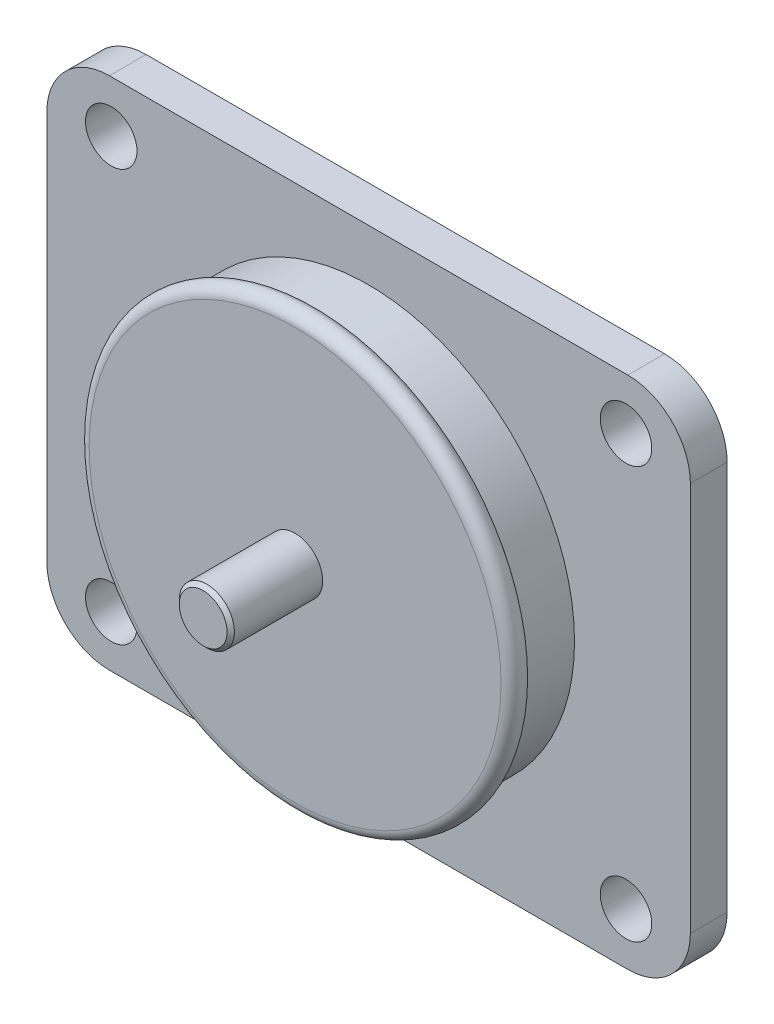
ISO-10303-21;
HEADER;
FILE_DESCRIPTION(('STEP AP214'),'2;1');
FILE_NAME('part.step','',(''),(''),'','','');
FILE_SCHEMA(('AUTOMOTIVE_DESIGN { 1 0 10303 214 1 1 1 1 }'));
ENDSEC;
DATA;
#1=APPLICATION_CONTEXT('core data for automotive mechanical design processes');
#2=APPLICATION_PROTOCOL_DEFINITION('international standard','automotive_design',2000,#1);
#3=PRODUCT_CONTEXT('',#1,'mechanical');
#4=PRODUCT('Part','Part','',(#3));
#5=PRODUCT_RELATED_PRODUCT_CATEGORY('part','',(#4));
#6=PRODUCT_DEFINITION_FORMATION('','',#4);
#7=PRODUCT_DEFINITION_CONTEXT('part definition',#1,'design');
#8=PRODUCT_DEFINITION('design','',#6,#7);
#9=PRODUCT_DEFINITION_SHAPE('','',#8);
#10=(LENGTH_UNIT() NAMED_UNIT(*) SI_UNIT(.MILLI.,.METRE.));
#11=(NAMED_UNIT(*) PLANE_ANGLE_UNIT() SI_UNIT($,.RADIAN.));
#12=(NAMED_UNIT(*) SI_UNIT($,.STERADIAN.) SOLID_ANGLE_UNIT());
#13=UNCERTAINTY_MEASURE_WITH_UNIT(LENGTH_MEASURE(1.E-05),#10,'distance_accuracy_value','');
#14=(GEOMETRIC_REPRESENTATION_CONTEXT(3) GLOBAL_UNCERTAINTY_ASSIGNED_CONTEXT((#13)) GLOBAL_UNIT_ASSIGNED_CONTEXT((#10,
#11,#12)) REPRESENTATION_CONTEXT('',''));
#15=CARTESIAN_POINT('',(0.,0.,0.));
#16=DIRECTION('',(0.,0.,1.));
#17=DIRECTION('',(1.,0.,0.));
#18=AXIS2_PLACEMENT_3D('',#15,#16,#17);
#19=CARTESIAN_POINT('',(0.,0.,16.9739730648032));
#20=DIRECTION('',(0.,0.,1.));
#21=DIRECTION('',(1.,0.,0.));
#22=AXIS2_PLACEMENT_3D('',#19,#20,#21);
#23=PLANE('',#22);
#24=CARTESIAN_POINT('',(0.,0.,16.9739730648032));
#25=DIRECTION('',(0.,0.,-1.));
#26=DIRECTION('',(-1.,0.,0.));
#27=AXIS2_PLACEMENT_3D('',#24,#25,#26);
#28=CIRCLE('',#27,14.);
#29=CARTESIAN_POINT('',(-14.,0.,16.9739730648032));
#30=VERTEX_POINT('',#29);
#31=EDGE_CURVE('E295',#30,#30,#28,.T.);
#32=ORIENTED_EDGE('',*,*,#31,.F.);
#33=EDGE_LOOP('',(#32));
#34=FACE_BOUND('',#33,.T.);
#35=CARTESIAN_POINT('',(0.,0.,16.9739730648032));
#36=DIRECTION('',(0.,0.,1.));
#37=DIRECTION('',(1.,0.,0.));
#38=AXIS2_PLACEMENT_3D('',#35,#36,#37);
#39=CIRCLE('',#38,1.875);
#40=CARTESIAN_POINT('',(1.875,0.,16.9739730648032));
#41=VERTEX_POINT('',#40);
#42=EDGE_CURVE('E299',#41,#41,#39,.T.);
#43=ORIENTED_EDGE('',*,*,#42,.F.);
#44=EDGE_LOOP('',(#43));
#45=FACE_BOUND('',#44,.T.);
#46=ADVANCED_FACE('F39',(#34,#45),#23,.T.);
#47=CARTESIAN_POINT('',(17.625,-13.25,11.9739730648032));
#48=DIRECTION('',(0.,0.,1.));
#49=DIRECTION('',(1.,0.,0.));
#50=AXIS2_PLACEMENT_3D('',#47,#48,#49);
#51=PLANE('',#50);
#52=CARTESIAN_POINT('',(17.5,14.,11.9739730648032));
#53=DIRECTION('',(0.,0.,1.));
#54=DIRECTION('',(1.,0.,0.));
#55=AXIS2_PLACEMENT_3D('',#52,#53,#54);
#56=CIRCLE('',#55,1.75);
#57=CARTESIAN_POINT('',(19.25,14.,11.9739730648032));
#58=VERTEX_POINT('',#57);
#59=EDGE_CURVE('E281',#58,#58,#56,.T.);
#60=ORIENTED_EDGE('',*,*,#59,.F.);
#61=EDGE_LOOP('',(#60));
#62=FACE_BOUND('',#61,.T.);
#63=CARTESIAN_POINT('',(-17.5,-14.,11.9739730648032));
#64=DIRECTION('',(0.,0.,1.));
#65=DIRECTION('',(1.,0.,0.));
#66=AXIS2_PLACEMENT_3D('',#63,#64,#65);
#67=CIRCLE('',#66,1.75);
#68=CARTESIAN_POINT('',(-15.75,-14.,11.9739730648032));
#69=VERTEX_POINT('',#68);
#70=EDGE_CURVE('E269',#69,#69,#67,.T.);
#71=ORIENTED_EDGE('',*,*,#70,.F.);
#72=EDGE_LOOP('',(#71));
#73=FACE_BOUND('',#72,.T.);
#74=CARTESIAN_POINT('',(17.625,-13.25,11.9739730648032));
#75=DIRECTION('',(0.,0.,1.));
#76=DIRECTION('',(1.,0.,0.));
#77=AXIS2_PLACEMENT_3D('',#74,#75,#76);
#78=CIRCLE('',#77,4.25);
#79=CARTESIAN_POINT('',(17.625,-17.5,11.9739730648032));
#80=VERTEX_POINT('',#79);
#81=CARTESIAN_POINT('',(21.875,-13.25,11.9739730648032));
#82=VERTEX_POINT('',#81);
#83=EDGE_CURVE('E153',#80,#82,#78,.T.);
#84=ORIENTED_EDGE('',*,*,#83,.T.);
#85=DIRECTION('',(0.,1.,0.));
#86=VECTOR('',#85,1.);
#87=CARTESIAN_POINT('',(21.875,13.25,11.9739730648032));
#88=LINE('',#87,#86);
#89=CARTESIAN_POINT('',(21.875,13.25,11.9739730648032));
#90=VERTEX_POINT('',#89);
#91=EDGE_CURVE('E100',#82,#90,#88,.T.);
#92=ORIENTED_EDGE('',*,*,#91,.T.);
#93=CARTESIAN_POINT('',(17.625,13.25,11.9739730648032));
#94=DIRECTION('',(0.,0.,1.));
#95=DIRECTION('',(-1.,0.,0.));
#96=AXIS2_PLACEMENT_3D('',#93,#94,#95);
#97=CIRCLE('',#96,4.25);
#98=CARTESIAN_POINT('',(17.625,17.5,11.9739730648032));
#99=VERTEX_POINT('',#98);
#100=EDGE_CURVE('E258',#90,#99,#97,.T.);
#101=ORIENTED_EDGE('',*,*,#100,.T.);
#102=DIRECTION('',(-1.,0.,0.));
#103=VECTOR('',#102,1.);
#104=CARTESIAN_POINT('',(-17.625,17.5,11.9739730648032));
#105=LINE('',#104,#103);
#106=CARTESIAN_POINT('',(-17.625,17.5,11.9739730648032));
#107=VERTEX_POINT('',#106);
#108=EDGE_CURVE('E260',#99,#107,#105,.T.);
#109=ORIENTED_EDGE('',*,*,#108,.T.);
#110=CARTESIAN_POINT('',(-17.625,13.25,11.9739730648032));
#111=DIRECTION('',(0.,0.,1.));
#112=DIRECTION('',(1.,0.,0.));
#113=AXIS2_PLACEMENT_3D('',#110,#111,#112);
#114=CIRCLE('',#113,4.25);
#115=CARTESIAN_POINT('',(-21.875,13.25,11.9739730648032));
#116=VERTEX_POINT('',#115);
#117=EDGE_CURVE('E120',#107,#116,#114,.T.);
#118=ORIENTED_EDGE('',*,*,#117,.T.);
#119=DIRECTION('',(0.,-1.,0.));
#120=VECTOR('',#119,1.);
#121=CARTESIAN_POINT('',(-21.875,13.25,11.9739730648032));
#122=LINE('',#121,#120);
#123=CARTESIAN_POINT('',(-21.875,-13.25,11.9739730648032));
#124=VERTEX_POINT('',#123);
#125=EDGE_CURVE('E113',#116,#124,#122,.T.);
#126=ORIENTED_EDGE('',*,*,#125,.T.);
#127=CARTESIAN_POINT('',(-17.625,-13.25,11.9739730648032));
#128=DIRECTION('',(0.,0.,1.));
#129=DIRECTION('',(1.,0.,0.));
#130=AXIS2_PLACEMENT_3D('',#127,#128,#129);
#131=CIRCLE('',#130,4.25);
#132=CARTESIAN_POINT('',(-17.625,-17.5,11.9739730648032));
#133=VERTEX_POINT('',#132);
#134=EDGE_CURVE('E118',#124,#133,#131,.T.);
#135=ORIENTED_EDGE('',*,*,#134,.T.);
#136=DIRECTION('',(1.,0.,0.));
#137=VECTOR('',#136,1.);
#138=CARTESIAN_POINT('',(-17.625,-17.5,11.9739730648032));
#139=LINE('',#138,#137);
#140=EDGE_CURVE('E56',#133,#80,#139,.T.);
#141=ORIENTED_EDGE('',*,*,#140,.T.);
#142=EDGE_LOOP('',(#84,#92,#101,#109,#118,#126,#135,#141));
#143=FACE_BOUND('',#142,.T.);
#144=CARTESIAN_POINT('',(-17.5,14.,11.9739730648032));
#145=DIRECTION('',(0.,0.,1.));
#146=DIRECTION('',(1.,0.,0.));
#147=AXIS2_PLACEMENT_3D('',#144,#145,#146);
#148=CIRCLE('',#147,1.75);
#149=CARTESIAN_POINT('',(-15.75,14.,11.9739730648032));
#150=VERTEX_POINT('',#149);
#151=EDGE_CURVE('E142',#150,#150,#148,.T.);
#152=ORIENTED_EDGE('',*,*,#151,.F.);
#153=EDGE_LOOP('',(#152));
#154=FACE_BOUND('',#153,.T.);
#155=CARTESIAN_POINT('',(17.5,-14.,11.9739730648032));
#156=DIRECTION('',(0.,0.,1.));
#157=DIRECTION('',(1.,0.,0.));
#158=AXIS2_PLACEMENT_3D('',#155,#156,#157);
#159=CIRCLE('',#158,1.75);
#160=CARTESIAN_POINT('',(19.25,-14.,11.9739730648032));
#161=VERTEX_POINT('',#160);
#162=EDGE_CURVE('E275',#161,#161,#159,.T.);
#163=ORIENTED_EDGE('',*,*,#162,.F.);
#164=EDGE_LOOP('',(#163));
#165=FACE_BOUND('',#164,.T.);
#166=CARTESIAN_POINT('',(0.,0.,11.9739730648032));
#167=DIRECTION('',(0.,0.,1.));
#168=DIRECTION('',(1.,0.,0.));
#169=AXIS2_PLACEMENT_3D('',#166,#167,#168);
#170=CIRCLE('',#169,14.);
#171=CARTESIAN_POINT('',(14.,0.,11.9739730648032));
#172=VERTEX_POINT('',#171);
#173=EDGE_CURVE('E287',#172,#172,#170,.T.);
#174=ORIENTED_EDGE('',*,*,#173,.F.);
#175=EDGE_LOOP('',(#174));
#176=FACE_BOUND('',#175,.T.);
#177=ADVANCED_FACE('F115',(#62,#73,#143,#154,#165,#176),#51,.T.);
#178=CARTESIAN_POINT('',(17.625,-13.25,9.47397306480322));
#179=DIRECTION('',(0.,0.,1.));
#180=DIRECTION('',(1.,0.,0.));
#181=AXIS2_PLACEMENT_3D('',#178,#179,#180);
#182=PLANE('',#181);
#183=CARTESIAN_POINT('',(0.,0.,9.47397306480322));
#184=DIRECTION('',(0.,0.,-1.));
#185=DIRECTION('',(-1.,0.,0.));
#186=AXIS2_PLACEMENT_3D('',#183,#184,#185);
#187=CIRCLE('',#186,11.25);
#188=CARTESIAN_POINT('',(-11.25,0.,9.47397306480322));
#189=VERTEX_POINT('',#188);
#190=EDGE_CURVE('E303',#189,#189,#187,.T.);
#191=ORIENTED_EDGE('',*,*,#190,.F.);
#192=EDGE_LOOP('',(#191));
#193=FACE_BOUND('',#192,.T.);
#194=CARTESIAN_POINT('',(17.5,-14.,9.47397306480322));
#195=DIRECTION('',(0.,0.,1.));
#196=DIRECTION('',(1.,0.,0.));
#197=AXIS2_PLACEMENT_3D('',#194,#195,#196);
#198=CIRCLE('',#197,1.75);
#199=CARTESIAN_POINT('',(19.25,-14.,9.47397306480322));
#200=VERTEX_POINT('',#199);
#201=EDGE_CURVE('E278',#200,#200,#198,.T.);
#202=ORIENTED_EDGE('',*,*,#201,.T.);
#203=EDGE_LOOP('',(#202));
#204=FACE_BOUND('',#203,.T.);
#205=CARTESIAN_POINT('',(-17.5,14.,9.47397306480322));
#206=DIRECTION('',(0.,0.,1.));
#207=DIRECTION('',(1.,0.,0.));
#208=AXIS2_PLACEMENT_3D('',#205,#206,#207);
#209=CIRCLE('',#208,1.75);
#210=CARTESIAN_POINT('',(-15.75,14.,9.47397306480322));
#211=VERTEX_POINT('',#210);
#212=EDGE_CURVE('E266',#211,#211,#209,.T.);
#213=ORIENTED_EDGE('',*,*,#212,.T.);
#214=EDGE_LOOP('',(#213));
#215=FACE_BOUND('',#214,.T.);
#216=CARTESIAN_POINT('',(17.625,-13.25,9.47397306480322));
#217=DIRECTION('',(0.,0.,1.));
#218=DIRECTION('',(1.,0.,0.));
#219=AXIS2_PLACEMENT_3D('',#216,#217,#218);
#220=CIRCLE('',#219,4.25);
#221=CARTESIAN_POINT('',(17.625,-17.5,9.47397306480322));
#222=VERTEX_POINT('',#221);
#223=CARTESIAN_POINT('',(21.875,-13.25,9.47397306480322));
#224=VERTEX_POINT('',#223);
#225=EDGE_CURVE('E138',#222,#224,#220,.T.);
#226=ORIENTED_EDGE('',*,*,#225,.F.);
#227=DIRECTION('',(1.,0.,0.));
#228=VECTOR('',#227,1.);
#229=CARTESIAN_POINT('',(-17.625,-17.5,9.47397306480322));
#230=LINE('',#229,#228);
#231=CARTESIAN_POINT('',(-17.625,-17.5,9.47397306480322));
#232=VERTEX_POINT('',#231);
#233=EDGE_CURVE('E91',#232,#222,#230,.T.);
#234=ORIENTED_EDGE('',*,*,#233,.F.);
#235=CARTESIAN_POINT('',(-17.625,-13.25,9.47397306480322));
#236=DIRECTION('',(0.,0.,1.));
#237=DIRECTION('',(1.,0.,0.));
#238=AXIS2_PLACEMENT_3D('',#235,#236,#237);
#239=CIRCLE('',#238,4.25);
#240=CARTESIAN_POINT('',(-21.875,-13.25,9.47397306480322));
#241=VERTEX_POINT('',#240);
#242=EDGE_CURVE('E85',#241,#232,#239,.T.);
#243=ORIENTED_EDGE('',*,*,#242,.F.);
#244=DIRECTION('',(0.,-1.,0.));
#245=VECTOR('',#244,1.);
#246=CARTESIAN_POINT('',(-21.875,13.25,9.47397306480322));
#247=LINE('',#246,#245);
#248=CARTESIAN_POINT('',(-21.875,13.25,9.47397306480322));
#249=VERTEX_POINT('',#248);
#250=EDGE_CURVE('E128',#249,#241,#247,.T.);
#251=ORIENTED_EDGE('',*,*,#250,.F.);
#252=CARTESIAN_POINT('',(-17.625,13.25,9.47397306480322));
#253=DIRECTION('',(0.,0.,1.));
#254=DIRECTION('',(1.,0.,0.));
#255=AXIS2_PLACEMENT_3D('',#252,#253,#254);
#256=CIRCLE('',#255,4.25);
#257=CARTESIAN_POINT('',(-17.625,17.5,9.47397306480322));
#258=VERTEX_POINT('',#257);
#259=EDGE_CURVE('E148',#258,#249,#256,.T.);
#260=ORIENTED_EDGE('',*,*,#259,.F.);
#261=DIRECTION('',(-1.,0.,0.));
#262=VECTOR('',#261,1.);
#263=CARTESIAN_POINT('',(-17.625,17.5,9.47397306480322));
#264=LINE('',#263,#262);
#265=CARTESIAN_POINT('',(17.625,17.5,9.47397306480322));
#266=VERTEX_POINT('',#265);
#267=EDGE_CURVE('E146',#266,#258,#264,.T.);
#268=ORIENTED_EDGE('',*,*,#267,.F.);
#269=CARTESIAN_POINT('',(17.625,13.25,9.47397306480322));
#270=DIRECTION('',(0.,0.,1.));
#271=DIRECTION('',(-1.,0.,0.));
#272=AXIS2_PLACEMENT_3D('',#269,#270,#271);
#273=CIRCLE('',#272,4.25);
#274=CARTESIAN_POINT('',(21.875,13.25,9.47397306480322));
#275=VERTEX_POINT('',#274);
#276=EDGE_CURVE('E144',#275,#266,#273,.T.);
#277=ORIENTED_EDGE('',*,*,#276,.F.);
#278=DIRECTION('',(0.,1.,0.));
#279=VECTOR('',#278,1.);
#280=CARTESIAN_POINT('',(21.875,13.25,9.47397306480322));
#281=LINE('',#280,#279);
#282=EDGE_CURVE('E141',#224,#275,#281,.T.);
#283=ORIENTED_EDGE('',*,*,#282,.F.);
#284=EDGE_LOOP('',(#226,#234,#243,#251,#260,#268,#277,#283));
#285=FACE_BOUND('',#284,.T.);
#286=CARTESIAN_POINT('',(-17.5,-14.,9.47397306480322));
#287=DIRECTION('',(0.,0.,1.));
#288=DIRECTION('',(1.,0.,0.));
#289=AXIS2_PLACEMENT_3D('',#286,#287,#288);
#290=CIRCLE('',#289,1.75);
#291=CARTESIAN_POINT('',(-15.75,-14.,9.47397306480322));
#292=VERTEX_POINT('',#291);
#293=EDGE_CURVE('E272',#292,#292,#290,.T.);
#294=ORIENTED_EDGE('',*,*,#293,.T.);
#295=EDGE_LOOP('',(#294));
#296=FACE_BOUND('',#295,.T.);
#297=CARTESIAN_POINT('',(17.5,14.,9.47397306480322));
#298=DIRECTION('',(0.,0.,1.));
#299=DIRECTION('',(1.,0.,0.));
#300=AXIS2_PLACEMENT_3D('',#297,#298,#299);
#301=CIRCLE('',#300,1.75);
#302=CARTESIAN_POINT('',(19.25,14.,9.47397306480322));
#303=VERTEX_POINT('',#302);
#304=EDGE_CURVE('E284',#303,#303,#301,.T.);
#305=ORIENTED_EDGE('',*,*,#304,.T.);
#306=EDGE_LOOP('',(#305));
#307=FACE_BOUND('',#306,.T.);
#308=ADVANCED_FACE('F191',(#193,#204,#215,#285,#296,#307),#182,.F.);
#309=CARTESIAN_POINT('',(17.625,-13.25,11.9739730648032));
#310=DIRECTION('',(0.,0.,-1.));
#311=DIRECTION('',(-1.,0.,0.));
#312=AXIS2_PLACEMENT_3D('',#309,#310,#311);
#313=CYLINDRICAL_SURFACE('',#312,4.25);
#314=ORIENTED_EDGE('',*,*,#225,.T.);
#315=DIRECTION('',(0.,0.,-1.));
#316=VECTOR('',#315,1.);
#317=CARTESIAN_POINT('',(21.875,-13.25,11.9739730648032));
#318=LINE('',#317,#316);
#319=EDGE_CURVE('E166',#82,#224,#318,.T.);
#320=ORIENTED_EDGE('',*,*,#319,.F.);
#321=ORIENTED_EDGE('',*,*,#83,.F.);
#322=DIRECTION('',(0.,0.,-1.));
#323=VECTOR('',#322,1.);
#324=CARTESIAN_POINT('',(17.625,-17.5,11.9739730648032));
#325=LINE('',#324,#323);
#326=EDGE_CURVE('E134',#80,#222,#325,.T.);
#327=ORIENTED_EDGE('',*,*,#326,.T.);
#328=EDGE_LOOP('',(#314,#320,#321,#327));
#329=FACE_BOUND('',#328,.T.);
#330=ADVANCED_FACE('F223',(#329),#313,.T.);
#331=CARTESIAN_POINT('',(21.875,13.25,11.9739730648032));
#332=DIRECTION('',(-1.,0.,0.));
#333=DIRECTION('',(0.,-1.,0.));
#334=AXIS2_PLACEMENT_3D('',#331,#332,#333);
#335=PLANE('',#334);
#336=ORIENTED_EDGE('',*,*,#282,.T.);
#337=DIRECTION('',(0.,0.,-1.));
#338=VECTOR('',#337,1.);
#339=CARTESIAN_POINT('',(21.875,13.25,11.9739730648032));
#340=LINE('',#339,#338);
#341=EDGE_CURVE('E163',#90,#275,#340,.T.);
#342=ORIENTED_EDGE('',*,*,#341,.F.);
#343=ORIENTED_EDGE('',*,*,#91,.F.);
#344=ORIENTED_EDGE('',*,*,#319,.T.);
#345=EDGE_LOOP('',(#336,#342,#343,#344));
#346=FACE_BOUND('',#345,.T.);
#347=ADVANCED_FACE('F242',(#346),#335,.F.);
#348=CARTESIAN_POINT('',(17.625,13.25,11.9739730648032));
#349=DIRECTION('',(0.,0.,-1.));
#350=DIRECTION('',(-1.,0.,0.));
#351=AXIS2_PLACEMENT_3D('',#348,#349,#350);
#352=CYLINDRICAL_SURFACE('',#351,4.25);
#353=ORIENTED_EDGE('',*,*,#276,.T.);
#354=DIRECTION('',(0.,0.,-1.));
#355=VECTOR('',#354,1.);
#356=CARTESIAN_POINT('',(17.625,17.5,11.9739730648032));
#357=LINE('',#356,#355);
#358=EDGE_CURVE('E160',#99,#266,#357,.T.);
#359=ORIENTED_EDGE('',*,*,#358,.F.);
#360=ORIENTED_EDGE('',*,*,#100,.F.);
#361=ORIENTED_EDGE('',*,*,#341,.T.);
#362=EDGE_LOOP('',(#353,#359,#360,#361));
#363=FACE_BOUND('',#362,.T.);
#364=ADVANCED_FACE('F238',(#363),#352,.T.);
#365=CARTESIAN_POINT('',(-17.625,17.5,11.9739730648032));
#366=DIRECTION('',(0.,-1.,0.));
#367=DIRECTION('',(0.,0.,-1.));
#368=AXIS2_PLACEMENT_3D('',#365,#366,#367);
#369=PLANE('',#368);
#370=ORIENTED_EDGE('',*,*,#267,.T.);
#371=DIRECTION('',(0.,0.,-1.));
#372=VECTOR('',#371,1.);
#373=CARTESIAN_POINT('',(-17.625,17.5,11.9739730648032));
#374=LINE('',#373,#372);
#375=EDGE_CURVE('E157',#107,#258,#374,.T.);
#376=ORIENTED_EDGE('',*,*,#375,.F.);
#377=ORIENTED_EDGE('',*,*,#108,.F.);
#378=ORIENTED_EDGE('',*,*,#358,.T.);
#379=EDGE_LOOP('',(#370,#376,#377,#378));
#380=FACE_BOUND('',#379,.T.);
#381=ADVANCED_FACE('F234',(#380),#369,.F.);
#382=CARTESIAN_POINT('',(-17.625,13.25,11.9739730648032));
#383=DIRECTION('',(0.,0.,-1.));
#384=DIRECTION('',(-1.,0.,0.));
#385=AXIS2_PLACEMENT_3D('',#382,#383,#384);
#386=CYLINDRICAL_SURFACE('',#385,4.25);
#387=ORIENTED_EDGE('',*,*,#259,.T.);
#388=DIRECTION('',(0.,0.,-1.));
#389=VECTOR('',#388,1.);
#390=CARTESIAN_POINT('',(-21.875,13.25,11.9739730648032));
#391=LINE('',#390,#389);
#392=EDGE_CURVE('E129',#116,#249,#391,.T.);
#393=ORIENTED_EDGE('',*,*,#392,.F.);
#394=ORIENTED_EDGE('',*,*,#117,.F.);
#395=ORIENTED_EDGE('',*,*,#375,.T.);
#396=EDGE_LOOP('',(#387,#393,#394,#395));
#397=FACE_BOUND('',#396,.T.);
#398=ADVANCED_FACE('F231',(#397),#386,.T.);
#399=CARTESIAN_POINT('',(-21.875,13.25,11.9739730648032));
#400=DIRECTION('',(1.,0.,0.));
#401=DIRECTION('',(0.,1.,0.));
#402=AXIS2_PLACEMENT_3D('',#399,#400,#401);
#403=PLANE('',#402);
#404=ORIENTED_EDGE('',*,*,#250,.T.);
#405=DIRECTION('',(0.,0.,-1.));
#406=VECTOR('',#405,1.);
#407=CARTESIAN_POINT('',(-21.875,-13.25,11.9739730648032));
#408=LINE('',#407,#406);
#409=EDGE_CURVE('E125',#124,#241,#408,.T.);
#410=ORIENTED_EDGE('',*,*,#409,.F.);
#411=ORIENTED_EDGE('',*,*,#125,.F.);
#412=ORIENTED_EDGE('',*,*,#392,.T.);
#413=EDGE_LOOP('',(#404,#410,#411,#412));
#414=FACE_BOUND('',#413,.T.);
#415=ADVANCED_FACE('F126',(#414),#403,.F.);
#416=CARTESIAN_POINT('',(-17.625,-13.25,11.9739730648032));
#417=DIRECTION('',(0.,0.,-1.));
#418=DIRECTION('',(-1.,0.,0.));
#419=AXIS2_PLACEMENT_3D('',#416,#417,#418);
#420=CYLINDRICAL_SURFACE('',#419,4.25);
#421=ORIENTED_EDGE('',*,*,#242,.T.);
#422=DIRECTION('',(0.,0.,-1.));
#423=VECTOR('',#422,1.);
#424=CARTESIAN_POINT('',(-17.625,-17.5,11.9739730648032));
#425=LINE('',#424,#423);
#426=EDGE_CURVE('E130',#133,#232,#425,.T.);
#427=ORIENTED_EDGE('',*,*,#426,.F.);
#428=ORIENTED_EDGE('',*,*,#134,.F.);
#429=ORIENTED_EDGE('',*,*,#409,.T.);
#430=EDGE_LOOP('',(#421,#427,#428,#429));
#431=FACE_BOUND('',#430,.T.);
#432=ADVANCED_FACE('F132',(#431),#420,.T.);
#433=CARTESIAN_POINT('',(-17.625,-17.5,11.9739730648032));
#434=DIRECTION('',(0.,1.,0.));
#435=DIRECTION('',(0.,0.,1.));
#436=AXIS2_PLACEMENT_3D('',#433,#434,#435);
#437=PLANE('',#436);
#438=ORIENTED_EDGE('',*,*,#233,.T.);
#439=ORIENTED_EDGE('',*,*,#326,.F.);
#440=ORIENTED_EDGE('',*,*,#140,.F.);
#441=ORIENTED_EDGE('',*,*,#426,.T.);
#442=EDGE_LOOP('',(#438,#439,#440,#441));
#443=FACE_BOUND('',#442,.T.);
#444=ADVANCED_FACE('F218',(#443),#437,.F.);
#445=CARTESIAN_POINT('',(-17.5,14.,11.9739730648032));
#446=DIRECTION('',(0.,0.,-1.));
#447=DIRECTION('',(-1.,0.,0.));
#448=AXIS2_PLACEMENT_3D('',#445,#446,#447);
#449=CYLINDRICAL_SURFACE('',#448,1.75);
#450=ORIENTED_EDGE('',*,*,#151,.T.);
#451=EDGE_LOOP('',(#450));
#452=FACE_BOUND('',#451,.T.);
#453=ORIENTED_EDGE('',*,*,#212,.F.);
#454=EDGE_LOOP('',(#453));
#455=FACE_BOUND('',#454,.T.);
#456=ADVANCED_FACE('F215',(#452,#455),#449,.F.);
#457=CARTESIAN_POINT('',(-17.5,-14.,11.9739730648032));
#458=DIRECTION('',(0.,0.,-1.));
#459=DIRECTION('',(-1.,0.,0.));
#460=AXIS2_PLACEMENT_3D('',#457,#458,#459);
#461=CYLINDRICAL_SURFACE('',#460,1.75);
#462=ORIENTED_EDGE('',*,*,#70,.T.);
#463=EDGE_LOOP('',(#462));
#464=FACE_BOUND('',#463,.T.);
#465=ORIENTED_EDGE('',*,*,#293,.F.);
#466=EDGE_LOOP('',(#465));
#467=FACE_BOUND('',#466,.T.);
#468=ADVANCED_FACE('F211',(#464,#467),#461,.F.);
#469=CARTESIAN_POINT('',(17.5,-14.,11.9739730648032));
#470=DIRECTION('',(0.,0.,-1.));
#471=DIRECTION('',(-1.,0.,0.));
#472=AXIS2_PLACEMENT_3D('',#469,#470,#471);
#473=CYLINDRICAL_SURFACE('',#472,1.75);
#474=ORIENTED_EDGE('',*,*,#162,.T.);
#475=EDGE_LOOP('',(#474));
#476=FACE_BOUND('',#475,.T.);
#477=ORIENTED_EDGE('',*,*,#201,.F.);
#478=EDGE_LOOP('',(#477));
#479=FACE_BOUND('',#478,.T.);
#480=ADVANCED_FACE('F207',(#476,#479),#473,.F.);
#481=CARTESIAN_POINT('',(17.5,14.,11.9739730648032));
#482=DIRECTION('',(0.,0.,-1.));
#483=DIRECTION('',(-1.,0.,0.));
#484=AXIS2_PLACEMENT_3D('',#481,#482,#483);
#485=CYLINDRICAL_SURFACE('',#484,1.75);
#486=ORIENTED_EDGE('',*,*,#59,.T.);
#487=EDGE_LOOP('',(#486));
#488=FACE_BOUND('',#487,.T.);
#489=ORIENTED_EDGE('',*,*,#304,.F.);
#490=EDGE_LOOP('',(#489));
#491=FACE_BOUND('',#490,.T.);
#492=ADVANCED_FACE('F203',(#488,#491),#485,.F.);
#493=CARTESIAN_POINT('',(0.,0.,16.9739730648032));
#494=DIRECTION('',(0.,0.,-1.));
#495=DIRECTION('',(-1.,0.,0.));
#496=AXIS2_PLACEMENT_3D('',#493,#494,#495);
#497=CYLINDRICAL_SURFACE('',#496,14.);
#498=CARTESIAN_POINT('',(0.,0.,15.4739730648032));
#499=DIRECTION('',(0.,0.,1.));
#500=DIRECTION('',(1.,0.,0.));
#501=AXIS2_PLACEMENT_3D('',#498,#499,#500);
#502=CIRCLE('',#501,14.);
#503=CARTESIAN_POINT('',(14.,0.,15.4739730648032));
#504=VERTEX_POINT('',#503);
#505=EDGE_CURVE('E292',#504,#504,#502,.F.);
#506=ORIENTED_EDGE('',*,*,#505,.T.);
#507=EDGE_LOOP('',(#506));
#508=FACE_BOUND('',#507,.T.);
#509=ORIENTED_EDGE('',*,*,#173,.T.);
#510=EDGE_LOOP('',(#509));
#511=FACE_BOUND('',#510,.T.);
#512=ADVANCED_FACE('F200',(#508,#511),#497,.T.);
#513=CARTESIAN_POINT('',(0.,0.,16.2239730648032));
#514=DIRECTION('',(0.,0.,-1.));
#515=DIRECTION('',(-1.,0.,0.));
#516=AXIS2_PLACEMENT_3D('',#513,#514,#515);
#517=TOROIDAL_SURFACE('',#516,14.,0.75);
#518=ORIENTED_EDGE('',*,*,#31,.T.);
#519=EDGE_LOOP('',(#518));
#520=FACE_BOUND('',#519,.T.);
#521=ORIENTED_EDGE('',*,*,#505,.F.);
#522=EDGE_LOOP('',(#521));
#523=FACE_BOUND('',#522,.T.);
#524=ADVANCED_FACE('F198',(#520,#523),#517,.T.);
#525=CARTESIAN_POINT('',(0.,0.,23.2239730648032));
#526=DIRECTION('',(0.,0.,-1.));
#527=DIRECTION('',(-1.,0.,0.));
#528=AXIS2_PLACEMENT_3D('',#525,#526,#527);
#529=CYLINDRICAL_SURFACE('',#528,1.875);
#530=CARTESIAN_POINT('',(0.,0.,22.9739730648032));
#531=DIRECTION('',(0.,0.,1.));
#532=DIRECTION('',(1.,0.,0.));
#533=AXIS2_PLACEMENT_3D('',#530,#531,#532);
#534=CIRCLE('',#533,1.875);
#535=CARTESIAN_POINT('',(1.875,0.,22.9739730648032));
#536=VERTEX_POINT('',#535);
#537=EDGE_CURVE('E11',#536,#536,#534,.F.);
#538=ORIENTED_EDGE('',*,*,#537,.T.);
#539=EDGE_LOOP('',(#538));
#540=FACE_BOUND('',#539,.T.);
#541=ORIENTED_EDGE('',*,*,#42,.T.);
#542=EDGE_LOOP('',(#541));
#543=FACE_BOUND('',#542,.T.);
#544=ADVANCED_FACE('F182',(#540,#543),#529,.T.);
#545=CARTESIAN_POINT('',(0.,0.,23.2239730648032));
#546=DIRECTION('',(0.,0.,1.));
#547=DIRECTION('',(1.,0.,0.));
#548=AXIS2_PLACEMENT_3D('',#545,#546,#547);
#549=PLANE('',#548);
#550=CARTESIAN_POINT('',(0.,0.,23.2239730648032));
#551=DIRECTION('',(0.,0.,1.));
#552=DIRECTION('',(1.,0.,0.));
#553=AXIS2_PLACEMENT_3D('',#550,#551,#552);
#554=CIRCLE('',#553,1.625);
#555=CARTESIAN_POINT('',(1.625,0.,23.2239730648032));
#556=VERTEX_POINT('',#555);
#557=EDGE_CURVE('E48',#556,#556,#554,.T.);
#558=ORIENTED_EDGE('',*,*,#557,.T.);
#559=EDGE_LOOP('',(#558));
#560=FACE_BOUND('',#559,.T.);
#561=ADVANCED_FACE('F170',(#560),#549,.T.);
#562=CARTESIAN_POINT('',(0.,0.,23.2239730648032));
#563=DIRECTION('',(0.,0.,-1.));
#564=DIRECTION('',(-1.,0.,0.));
#565=AXIS2_PLACEMENT_3D('',#562,#563,#564);
#566=CONICAL_SURFACE('',#565,1.625,0.785398163397435);
#567=ORIENTED_EDGE('',*,*,#537,.F.);
#568=EDGE_LOOP('',(#567));
#569=FACE_BOUND('',#568,.T.);
#570=ORIENTED_EDGE('',*,*,#557,.F.);
#571=EDGE_LOOP('',(#570));
#572=FACE_BOUND('',#571,.T.);
#573=ADVANCED_FACE('F41',(#569,#572),#566,.T.);
#574=CARTESIAN_POINT('',(0.,0.,9.97397306480322));
#575=DIRECTION('',(0.,0.,-1.));
#576=DIRECTION('',(-1.,0.,0.));
#577=AXIS2_PLACEMENT_3D('',#574,#575,#576);
#578=CYLINDRICAL_SURFACE('',#577,11.25);
#579=CARTESIAN_POINT('',(0.,0.,9.97397306480322));
#580=DIRECTION('',(0.,0.,-1.));
#581=DIRECTION('',(-1.,0.,0.));
#582=AXIS2_PLACEMENT_3D('',#579,#580,#581);
#583=CIRCLE('',#582,11.25);
#584=CARTESIAN_POINT('',(-11.25,0.,9.97397306480322));
#585=VERTEX_POINT('',#584);
#586=EDGE_CURVE('E302',#585,#585,#583,.T.);
#587=ORIENTED_EDGE('',*,*,#586,.F.);
#588=EDGE_LOOP('',(#587));
#589=FACE_BOUND('',#588,.T.);
#590=ORIENTED_EDGE('',*,*,#190,.T.);
#591=EDGE_LOOP('',(#590));
#592=FACE_BOUND('',#591,.T.);
#593=ADVANCED_FACE('F173',(#589,#592),#578,.F.);
#594=CARTESIAN_POINT('',(0.,0.,9.97397306480322));
#595=DIRECTION('',(0.,0.,-1.));
#596=DIRECTION('',(-1.,0.,0.));
#597=AXIS2_PLACEMENT_3D('',#594,#595,#596);
#598=PLANE('',#597);
#599=ORIENTED_EDGE('',*,*,#586,.T.);
#600=EDGE_LOOP('',(#599));
#601=FACE_BOUND('',#600,.T.);
#602=ADVANCED_FACE('F179',(#601),#598,.T.);
#603=CLOSED_SHELL('',(#46,#177,#308,#330,#347,#364,#381,#398,#415,#432,#444,#456,#468,#480,#492,
#512,#524,#544,#561,#573,#593,#602));
#604=MANIFOLD_SOLID_BREP('B2',#603);
#605=ADVANCED_BREP_SHAPE_REPRESENTATION('',(#18,#604),#14);
#606=SHAPE_DEFINITION_REPRESENTATION(#9,#605);
ENDSEC;
END-ISO-10303-21;
